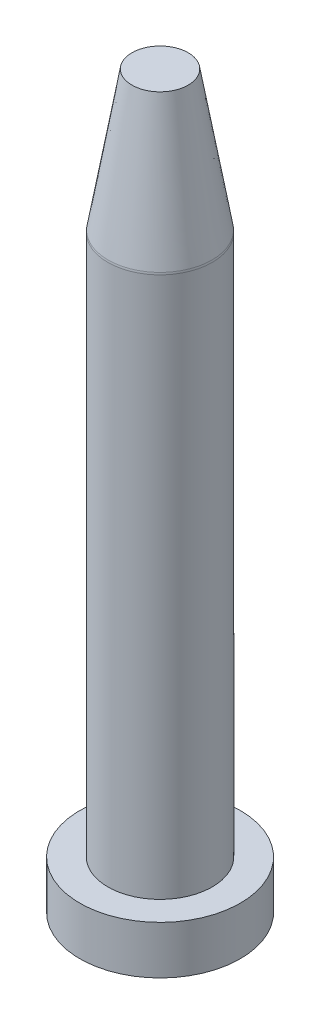
ISO-10303-21;
HEADER;
FILE_DESCRIPTION(('STEP AP214'),'2;1');
FILE_NAME('part.step','',(''),(''),'','','');
FILE_SCHEMA(('AUTOMOTIVE_DESIGN { 1 0 10303 214 1 1 1 1 }'));
ENDSEC;
DATA;
#1=APPLICATION_CONTEXT('core data for automotive mechanical design processes');
#2=APPLICATION_PROTOCOL_DEFINITION('international standard','automotive_design',2000,#1);
#3=PRODUCT_CONTEXT('',#1,'mechanical');
#4=PRODUCT('Part','Part','',(#3));
#5=PRODUCT_RELATED_PRODUCT_CATEGORY('part','',(#4));
#6=PRODUCT_DEFINITION_FORMATION('','',#4);
#7=PRODUCT_DEFINITION_CONTEXT('part definition',#1,'design');
#8=PRODUCT_DEFINITION('design','',#6,#7);
#9=PRODUCT_DEFINITION_SHAPE('','',#8);
#10=(LENGTH_UNIT() NAMED_UNIT(*) SI_UNIT(.MILLI.,.METRE.));
#11=(NAMED_UNIT(*) PLANE_ANGLE_UNIT() SI_UNIT($,.RADIAN.));
#12=(NAMED_UNIT(*) SI_UNIT($,.STERADIAN.) SOLID_ANGLE_UNIT());
#13=UNCERTAINTY_MEASURE_WITH_UNIT(LENGTH_MEASURE(1.E-05),#10,'distance_accuracy_value','');
#14=(GEOMETRIC_REPRESENTATION_CONTEXT(3) GLOBAL_UNCERTAINTY_ASSIGNED_CONTEXT((#13)) GLOBAL_UNIT_ASSIGNED_CONTEXT((#10,
#11,#12)) REPRESENTATION_CONTEXT('',''));
#15=CARTESIAN_POINT('',(0.,0.,0.));
#16=DIRECTION('',(0.,0.,1.));
#17=DIRECTION('',(1.,0.,0.));
#18=AXIS2_PLACEMENT_3D('',#15,#16,#17);
#19=CARTESIAN_POINT('',(0.,182.,0.));
#20=DIRECTION('',(0.,1.,0.));
#21=DIRECTION('',(0.,0.,1.));
#22=AXIS2_PLACEMENT_3D('',#19,#20,#21);
#23=PLANE('',#22);
#24=CARTESIAN_POINT('',(0.,182.,0.));
#25=DIRECTION('',(0.,-1.,0.));
#26=DIRECTION('',(0.,0.,-1.));
#27=AXIS2_PLACEMENT_3D('',#24,#25,#26);
#28=CIRCLE('',#27,7.);
#29=CARTESIAN_POINT('',(0.,182.,-7.));
#30=VERTEX_POINT('',#29);
#31=EDGE_CURVE('E43',#30,#30,#28,.T.);
#32=ORIENTED_EDGE('',*,*,#31,.F.);
#33=EDGE_LOOP('',(#32));
#34=FACE_BOUND('',#33,.T.);
#35=ADVANCED_FACE('F32',(#34),#23,.T.);
#36=CARTESIAN_POINT('',(0.,147.,0.));
#37=DIRECTION('',(0.,-1.,0.));
#38=DIRECTION('',(0.,0.,-1.));
#39=AXIS2_PLACEMENT_3D('',#36,#37,#38);
#40=CONICAL_SURFACE('',#39,13.,0.169778273968339);
#41=CARTESIAN_POINT('',(0.,147.251610540768,0.));
#42=DIRECTION('',(0.,1.,0.));
#43=DIRECTION('',(0.,0.,1.));
#44=AXIS2_PLACEMENT_3D('',#41,#42,#43);
#45=CIRCLE('',#44,12.9568667644398);
#46=CARTESIAN_POINT('',(0.,147.251610540768,12.9568667644398));
#47=VERTEX_POINT('',#46);
#48=EDGE_CURVE('E10',#47,#47,#45,.T.);
#49=ORIENTED_EDGE('',*,*,#48,.T.);
#50=EDGE_LOOP('',(#49));
#51=FACE_BOUND('',#50,.T.);
#52=ORIENTED_EDGE('',*,*,#31,.T.);
#53=EDGE_LOOP('',(#52));
#54=FACE_BOUND('',#53,.T.);
#55=ADVANCED_FACE('F75',(#51,#54),#40,.T.);
#56=CARTESIAN_POINT('',(0.,0.,0.));
#57=DIRECTION('',(0.,-1.,0.));
#58=DIRECTION('',(0.,0.,-1.));
#59=AXIS2_PLACEMENT_3D('',#56,#57,#58);
#60=CYLINDRICAL_SURFACE('',#59,13.);
#61=CARTESIAN_POINT('',(0.,146.744719095435,0.));
#62=DIRECTION('',(0.,1.,0.));
#63=DIRECTION('',(0.,0.,1.));
#64=AXIS2_PLACEMENT_3D('',#61,#62,#63);
#65=CIRCLE('',#64,13.);
#66=CARTESIAN_POINT('',(0.,146.744719095435,13.));
#67=VERTEX_POINT('',#66);
#68=EDGE_CURVE('E39',#67,#67,#65,.F.);
#69=ORIENTED_EDGE('',*,*,#68,.T.);
#70=EDGE_LOOP('',(#69));
#71=FACE_BOUND('',#70,.T.);
#72=CARTESIAN_POINT('',(0.,12.,0.));
#73=DIRECTION('',(0.,-1.,0.));
#74=DIRECTION('',(0.,0.,-1.));
#75=AXIS2_PLACEMENT_3D('',#72,#73,#74);
#76=CIRCLE('',#75,13.);
#77=CARTESIAN_POINT('',(0.,12.,-13.));
#78=VERTEX_POINT('',#77);
#79=EDGE_CURVE('E47',#78,#78,#76,.T.);
#80=ORIENTED_EDGE('',*,*,#79,.F.);
#81=EDGE_LOOP('',(#80));
#82=FACE_BOUND('',#81,.T.);
#83=ADVANCED_FACE('F71',(#71,#82),#60,.T.);
#84=CARTESIAN_POINT('',(20.,12.,0.));
#85=DIRECTION('',(0.,1.,0.));
#86=DIRECTION('',(0.,0.,1.));
#87=AXIS2_PLACEMENT_3D('',#84,#85,#86);
#88=PLANE('',#87);
#89=ORIENTED_EDGE('',*,*,#79,.T.);
#90=EDGE_LOOP('',(#89));
#91=FACE_BOUND('',#90,.T.);
#92=CARTESIAN_POINT('',(0.,12.,0.));
#93=DIRECTION('',(0.,-1.,0.));
#94=DIRECTION('',(0.,0.,-1.));
#95=AXIS2_PLACEMENT_3D('',#92,#93,#94);
#96=CIRCLE('',#95,20.);
#97=CARTESIAN_POINT('',(0.,12.,-20.));
#98=VERTEX_POINT('',#97);
#99=EDGE_CURVE('E52',#98,#98,#96,.T.);
#100=ORIENTED_EDGE('',*,*,#99,.F.);
#101=EDGE_LOOP('',(#100));
#102=FACE_BOUND('',#101,.T.);
#103=ADVANCED_FACE('F63',(#91,#102),#88,.T.);
#104=CARTESIAN_POINT('',(0.,0.,0.));
#105=DIRECTION('',(0.,-1.,0.));
#106=DIRECTION('',(0.,0.,-1.));
#107=AXIS2_PLACEMENT_3D('',#104,#105,#106);
#108=CYLINDRICAL_SURFACE('',#107,20.);
#109=ORIENTED_EDGE('',*,*,#99,.T.);
#110=EDGE_LOOP('',(#109));
#111=FACE_BOUND('',#110,.T.);
#112=CARTESIAN_POINT('',(0.,0.,0.));
#113=DIRECTION('',(0.,-1.,0.));
#114=DIRECTION('',(0.,0.,-1.));
#115=AXIS2_PLACEMENT_3D('',#112,#113,#114);
#116=CIRCLE('',#115,20.);
#117=CARTESIAN_POINT('',(0.,0.,-20.));
#118=VERTEX_POINT('',#117);
#119=EDGE_CURVE('E55',#118,#118,#116,.T.);
#120=ORIENTED_EDGE('',*,*,#119,.F.);
#121=EDGE_LOOP('',(#120));
#122=FACE_BOUND('',#121,.T.);
#123=ADVANCED_FACE('F61',(#111,#122),#108,.T.);
#124=CARTESIAN_POINT('',(0.,0.,0.));
#125=DIRECTION('',(0.,-1.,0.));
#126=DIRECTION('',(0.,0.,-1.));
#127=AXIS2_PLACEMENT_3D('',#124,#125,#126);
#128=PLANE('',#127);
#129=ORIENTED_EDGE('',*,*,#119,.T.);
#130=EDGE_LOOP('',(#129));
#131=FACE_BOUND('',#130,.T.);
#132=ADVANCED_FACE('F59',(#131),#128,.T.);
#133=CARTESIAN_POINT('',(0.,146.744719095435,0.));
#134=DIRECTION('',(0.,1.,0.));
#135=DIRECTION('',(0.,0.,1.));
#136=AXIS2_PLACEMENT_3D('',#133,#134,#135);
#137=TOROIDAL_SURFACE('',#136,10.,3.);
#138=ORIENTED_EDGE('',*,*,#48,.F.);
#139=EDGE_LOOP('',(#138));
#140=FACE_BOUND('',#139,.T.);
#141=ORIENTED_EDGE('',*,*,#68,.F.);
#142=EDGE_LOOP('',(#141));
#143=FACE_BOUND('',#142,.T.);
#144=ADVANCED_FACE('F34',(#140,#143),#137,.T.);
#145=CLOSED_SHELL('',(#35,#55,#83,#103,#123,#132,#144));
#146=MANIFOLD_SOLID_BREP('B2',#145);
#147=ADVANCED_BREP_SHAPE_REPRESENTATION('',(#18,#146),#14);
#148=SHAPE_DEFINITION_REPRESENTATION(#9,#147);
ENDSEC;
END-ISO-10303-21;
